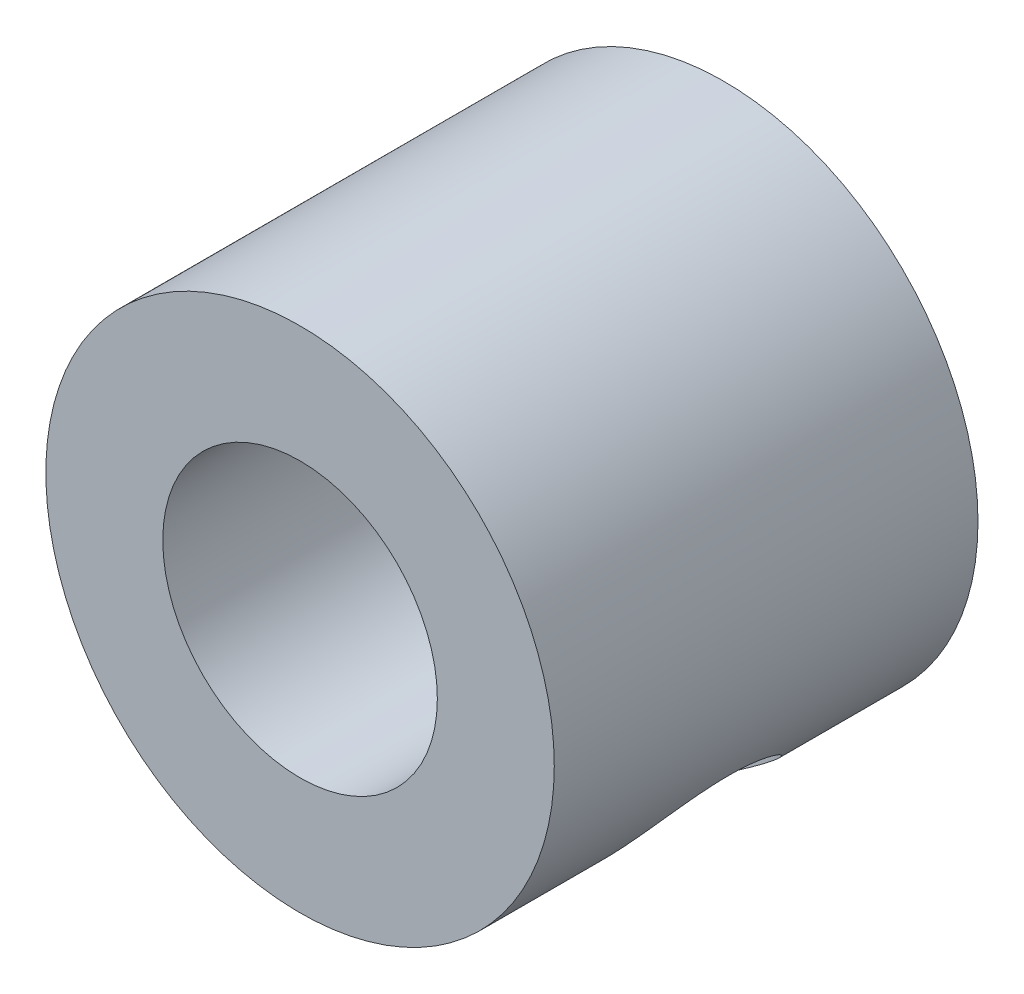
ISO-10303-21;
HEADER;
FILE_DESCRIPTION(('STEP AP214'),'2;1');
FILE_NAME('part.step','',(''),(''),'','','');
FILE_SCHEMA(('AUTOMOTIVE_DESIGN { 1 0 10303 214 1 1 1 1 }'));
ENDSEC;
DATA;
#1=APPLICATION_CONTEXT('core data for automotive mechanical design processes');
#2=APPLICATION_PROTOCOL_DEFINITION('international standard','automotive_design',2000,#1);
#3=PRODUCT_CONTEXT('',#1,'mechanical');
#4=PRODUCT('Part','Part','',(#3));
#5=PRODUCT_RELATED_PRODUCT_CATEGORY('part','',(#4));
#6=PRODUCT_DEFINITION_FORMATION('','',#4);
#7=PRODUCT_DEFINITION_CONTEXT('part definition',#1,'design');
#8=PRODUCT_DEFINITION('design','',#6,#7);
#9=PRODUCT_DEFINITION_SHAPE('','',#8);
#10=(LENGTH_UNIT() NAMED_UNIT(*) SI_UNIT(.MILLI.,.METRE.));
#11=(NAMED_UNIT(*) PLANE_ANGLE_UNIT() SI_UNIT($,.RADIAN.));
#12=(NAMED_UNIT(*) SI_UNIT($,.STERADIAN.) SOLID_ANGLE_UNIT());
#13=UNCERTAINTY_MEASURE_WITH_UNIT(LENGTH_MEASURE(1.E-05),#10,'distance_accuracy_value','');
#14=(GEOMETRIC_REPRESENTATION_CONTEXT(3) GLOBAL_UNCERTAINTY_ASSIGNED_CONTEXT((#13)) GLOBAL_UNIT_ASSIGNED_CONTEXT((#10,
#11,#12)) REPRESENTATION_CONTEXT('',''));
#15=CARTESIAN_POINT('',(0.,0.,0.));
#16=DIRECTION('',(0.,0.,1.));
#17=DIRECTION('',(1.,0.,0.));
#18=AXIS2_PLACEMENT_3D('',#15,#16,#17);
#19=CARTESIAN_POINT('',(0.,0.,5.));
#20=DIRECTION('',(0.,0.,1.));
#21=DIRECTION('',(1.,0.,0.));
#22=AXIS2_PLACEMENT_3D('',#19,#20,#21);
#23=PLANE('',#22);
#24=CARTESIAN_POINT('',(0.,0.,5.));
#25=DIRECTION('',(0.,0.,1.));
#26=DIRECTION('',(1.,0.,0.));
#27=AXIS2_PLACEMENT_3D('',#24,#25,#26);
#28=CIRCLE('',#27,3.);
#29=CARTESIAN_POINT('',(3.,0.,5.));
#30=VERTEX_POINT('',#29);
#31=EDGE_CURVE('E10',#30,#30,#28,.T.);
#32=ORIENTED_EDGE('',*,*,#31,.T.);
#33=EDGE_LOOP('',(#32));
#34=FACE_BOUND('',#33,.T.);
#35=CARTESIAN_POINT('',(0.,0.,5.));
#36=DIRECTION('',(0.,0.,1.));
#37=DIRECTION('',(1.,0.,0.));
#38=AXIS2_PLACEMENT_3D('',#35,#36,#37);
#39=CIRCLE('',#38,1.62);
#40=CARTESIAN_POINT('',(1.62,0.,5.));
#41=VERTEX_POINT('',#40);
#42=EDGE_CURVE('E48',#41,#41,#39,.T.);
#43=ORIENTED_EDGE('',*,*,#42,.F.);
#44=EDGE_LOOP('',(#43));
#45=FACE_BOUND('',#44,.T.);
#46=ADVANCED_FACE('F36',(#34,#45),#23,.T.);
#47=CARTESIAN_POINT('',(0.,0.,0.));
#48=DIRECTION('',(0.,0.,1.));
#49=DIRECTION('',(1.,0.,0.));
#50=AXIS2_PLACEMENT_3D('',#47,#48,#49);
#51=PLANE('',#50);
#52=CARTESIAN_POINT('',(0.,0.,0.));
#53=DIRECTION('',(0.,0.,1.));
#54=DIRECTION('',(1.,0.,0.));
#55=AXIS2_PLACEMENT_3D('',#52,#53,#54);
#56=CIRCLE('',#55,3.);
#57=CARTESIAN_POINT('',(3.,0.,0.));
#58=VERTEX_POINT('',#57);
#59=EDGE_CURVE('E41',#58,#58,#56,.T.);
#60=ORIENTED_EDGE('',*,*,#59,.F.);
#61=EDGE_LOOP('',(#60));
#62=FACE_BOUND('',#61,.T.);
#63=CARTESIAN_POINT('',(0.,0.,0.));
#64=DIRECTION('',(0.,0.,1.));
#65=DIRECTION('',(1.,0.,0.));
#66=AXIS2_PLACEMENT_3D('',#63,#64,#65);
#67=CIRCLE('',#66,1.62);
#68=CARTESIAN_POINT('',(1.62,0.,0.));
#69=VERTEX_POINT('',#68);
#70=EDGE_CURVE('E50',#69,#69,#67,.T.);
#71=ORIENTED_EDGE('',*,*,#70,.T.);
#72=EDGE_LOOP('',(#71));
#73=FACE_BOUND('',#72,.T.);
#74=ADVANCED_FACE('F79',(#62,#73),#51,.F.);
#75=CARTESIAN_POINT('',(0.,0.,5.));
#76=DIRECTION('',(0.,0.,-1.));
#77=DIRECTION('',(-1.,0.,0.));
#78=AXIS2_PLACEMENT_3D('',#75,#76,#77);
#79=CYLINDRICAL_SURFACE('',#78,3.);
#80=CARTESIAN_POINT('',(0.739618016125054,-2.90739835423755,2.5));
#81=CARTESIAN_POINT('',(0.739614752000209,-2.90739796712364,2.56101813663896));
#82=CARTESIAN_POINT('',(0.744813597752829,-2.9060911034385,2.62202056284591));
#83=CARTESIAN_POINT('',(0.76526503725104,-2.90077229528854,2.74218484382022));
#84=CARTESIAN_POINT('',(0.780517255640158,-2.89676045181772,2.80134676721893));
#85=CARTESIAN_POINT('',(0.820134425312808,-2.88579211793485,2.91606066757425));
#86=CARTESIAN_POINT('',(0.844477353800911,-2.87884273855745,2.97162099093799));
#87=CARTESIAN_POINT('',(0.901072264841386,-2.86163254910078,3.077995896953));
#88=CARTESIAN_POINT('',(0.933326646620744,-2.85137073419359,3.12880903350555));
#89=CARTESIAN_POINT('',(1.00603391773113,-2.8265587509176,3.22679720527209));
#90=CARTESIAN_POINT('',(1.04679376878659,-2.81183425795071,3.2737004036486));
#91=CARTESIAN_POINT('',(1.13393194453624,-2.77783794733051,3.36006599547149));
#92=CARTESIAN_POINT('',(1.18031147875629,-2.75856514989553,3.39952678239674));
#93=CARTESIAN_POINT('',(1.27873069768353,-2.71437871750808,3.47120041370083));
#94=CARTESIAN_POINT('',(1.33091019478213,-2.68929386729197,3.50311728538749));
#95=CARTESIAN_POINT('',(1.43760485141988,-2.63379963602439,3.55681558519246));
#96=CARTESIAN_POINT('',(1.49211918533939,-2.60339212556305,3.57860056424879));
#97=CARTESIAN_POINT('',(1.59906488803522,-2.53903811323399,3.61046181083468));
#98=CARTESIAN_POINT('',(1.6514837110736,-2.50530309604205,3.62100618459055));
#99=CARTESIAN_POINT('',(1.75478735428696,-2.43406097562897,3.63158729810365));
#100=CARTESIAN_POINT('',(1.805672672499,-2.39655511460608,3.63162748689658));
#101=CARTESIAN_POINT('',(1.90182338742011,-2.32091054159144,3.62147058362302));
#102=CARTESIAN_POINT('',(1.94724253121438,-2.28289694439422,3.61178457210585));
#103=CARTESIAN_POINT('',(2.0341504014462,-2.2058122594158,3.5833105992365));
#104=CARTESIAN_POINT('',(2.07563884901385,-2.16674109685627,3.56452199266254));
#105=CARTESIAN_POINT('',(2.15450923770586,-2.08835560004707,3.51814133714635));
#106=CARTESIAN_POINT('',(2.1918223934854,-2.0490460416503,3.49042478361183));
#107=CARTESIAN_POINT('',(2.26120944046165,-1.97221091217223,3.42708564664656));
#108=CARTESIAN_POINT('',(2.29328162710737,-1.93468592429934,3.39146049990748));
#109=CARTESIAN_POINT('',(2.35373048969377,-1.86074369979092,3.31085844315593));
#110=CARTESIAN_POINT('',(2.38177741335426,-1.82452249962875,3.26545373941419));
#111=CARTESIAN_POINT('',(2.43173192025713,-1.75739429138224,3.16782503055808));
#112=CARTESIAN_POINT('',(2.45363793183586,-1.7264886445055,3.11559928471646));
#113=CARTESIAN_POINT('',(2.49173867267264,-1.67104737272896,3.00429096561629));
#114=CARTESIAN_POINT('',(2.50779320407762,-1.64667141938392,2.9450801470621));
#115=CARTESIAN_POINT('',(2.53346804066745,-1.6068935592993,2.82240630334902));
#116=CARTESIAN_POINT('',(2.54309196715564,-1.59148660242805,2.75894569359098));
#117=CARTESIAN_POINT('',(2.55553564947608,-1.57142293838382,2.63334876547248));
#118=CARTESIAN_POINT('',(2.55870395375538,-1.56621616535229,2.57133498368438));
#119=CARTESIAN_POINT('',(2.55927681088035,-1.56528074382059,2.44721760437008));
#120=CARTESIAN_POINT('',(2.55668282373574,-1.56954969442664,2.38511403357844));
#121=CARTESIAN_POINT('',(2.54601068058257,-1.58679625688727,2.26571111370284));
#122=CARTESIAN_POINT('',(2.53820230030048,-1.59934512814585,2.20832436208521));
#123=CARTESIAN_POINT('',(2.51739757812413,-1.63189455227808,2.09669661413096));
#124=CARTESIAN_POINT('',(2.50440016722658,-1.65189664054825,2.04245626863086));
#125=CARTESIAN_POINT('',(2.47263536489686,-1.69909100064847,1.93638563609826));
#126=CARTESIAN_POINT('',(2.45366885649637,-1.72652598692998,1.88472338339198));
#127=CARTESIAN_POINT('',(2.41014616603731,-1.7867777894499,1.78721061199356));
#128=CARTESIAN_POINT('',(2.3855879209934,-1.81959659071189,1.74136224799039));
#129=CARTESIAN_POINT('',(2.32913562302335,-1.89138568549983,1.65372970517089));
#130=CARTESIAN_POINT('',(2.29687224969338,-1.93061544359174,1.61239442350959));
#131=CARTESIAN_POINT('',(2.22617301710366,-2.01172669205411,1.53852022619436));
#132=CARTESIAN_POINT('',(2.18773712377136,-2.05360819706153,1.50598135909962));
#133=CARTESIAN_POINT('',(2.1052527026915,-2.13807862505327,1.4508321746073));
#134=CARTESIAN_POINT('',(2.06122293593891,-2.18066478750009,1.42818974427247));
#135=CARTESIAN_POINT('',(1.96832006220759,-2.26487041478652,1.39356794559513));
#136=CARTESIAN_POINT('',(1.91944926781643,-2.30649032959083,1.38158351290485));
#137=CARTESIAN_POINT('',(1.82119250488052,-2.3847369270471,1.36916783652974));
#138=CARTESIAN_POINT('',(1.77200560418259,-2.42151331032074,1.36809901225347));
#139=CARTESIAN_POINT('',(1.67199773656454,-2.49161613936039,1.37590184797056));
#140=CARTESIAN_POINT('',(1.62117697062316,-2.52494300733297,1.38477228986298));
#141=CARTESIAN_POINT('',(1.52080704439269,-2.58660650307536,1.41175350768873));
#142=CARTESIAN_POINT('',(1.47125761958077,-2.61504643014469,1.42962955539162));
#143=CARTESIAN_POINT('',(1.37368715073943,-2.66759393764062,1.47387995094849));
#144=CARTESIAN_POINT('',(1.32566639801285,-2.69170069635999,1.50025590801409));
#145=CARTESIAN_POINT('',(1.23064805152727,-2.73649065046568,1.5620233184274));
#146=CARTESIAN_POINT('',(1.18377922703172,-2.75698636090658,1.59774835422172));
#147=CARTESIAN_POINT('',(1.09482759745554,-2.79350469326137,1.67667557545808));
#148=CARTESIAN_POINT('',(1.05274651611616,-2.8095257071421,1.71988043985014));
#149=CARTESIAN_POINT('',(0.972780612058389,-2.8382388920146,1.81528319548287));
#150=CARTESIAN_POINT('',(0.935239850380158,-2.85070762713379,1.86783810508343));
#151=CARTESIAN_POINT('',(0.868824280584228,-2.87164788558065,1.97890925074341));
#152=CARTESIAN_POINT('',(0.839950530293186,-2.88011892105295,2.03742621331721));
#153=CARTESIAN_POINT('',(0.791313671493419,-2.89387269626417,2.16181258603167));
#154=CARTESIAN_POINT('',(0.772053214087564,-2.89898327955144,2.22789991696844));
#155=CARTESIAN_POINT('',(0.746211518334039,-2.90574515433204,2.36266598741546));
#156=CARTESIAN_POINT('',(0.739621688889111,-2.90739878981467,2.43134293884242));
#157=CARTESIAN_POINT('',(0.739618016125054,-2.90739835423755,2.5));
#158=B_SPLINE_CURVE_WITH_KNOTS('',3,(#80,#81,#82,#83,#84,#85,#86,#87,#88,#89,#90,#91,#92,#93,
#94,#95,#96,#97,#98,#99,#100,#101,#102,#103,#104,#105,#106,#107,#108,#109,#110,#111,#112,#113,
#114,#115,#116,#117,#118,#119,#120,#121,#122,#123,#124,#125,#126,#127,#128,#129,#130,#131,#132,
#133,#134,#135,#136,#137,#138,#139,#140,#141,#142,#143,#144,#145,#146,#147,#148,#149,#150,#151,
#152,#153,#154,#155,#156,#157),.UNSPECIFIED.,.T.,.F.,(4,2,2,2,2,2,2,2,2,2,2,2,2,2,2,2,2,2,2,2,2,
2,2,2,2,2,2,2,2,2,2,2,2,2,2,2,2,2,4),(0.,0.182798687678897,0.365590550704326,0.547942432096648,
0.730349682032612,0.921080888922843,1.11185322010347,1.30918710749725,1.5064517828052,
1.69513544671701,1.88375715651128,2.06296037041627,2.24217628869147,2.4240083102534,
2.60589935290765,2.79852376321542,2.99119742760116,3.18822362371484,3.38513877362039,
3.57110586771534,3.75702584812362,3.93400354020582,4.11101771066984,4.29470759898304,
4.47846536698335,4.67400202026015,4.86953975294349,5.06443818763901,5.25924396312408,
5.44260114028839,5.62593584867891,5.80472173005681,5.98354147926692,6.16991005225352,
6.35634551298868,6.5527362862576,6.74915101968909,6.95497407078195,7.16065751788153),.UNSPECIFIED.);
#159=CARTESIAN_POINT('',(0.739618016125054,-2.90739835423755,2.5));
#160=VERTEX_POINT('',#159);
#161=EDGE_CURVE('E62',#160,#160,#158,.T.);
#162=ORIENTED_EDGE('',*,*,#161,.T.);
#163=EDGE_LOOP('',(#162));
#164=FACE_BOUND('',#163,.T.);
#165=ORIENTED_EDGE('',*,*,#31,.F.);
#166=EDGE_LOOP('',(#165));
#167=FACE_BOUND('',#166,.T.);
#168=ORIENTED_EDGE('',*,*,#59,.T.);
#169=EDGE_LOOP('',(#168));
#170=FACE_BOUND('',#169,.T.);
#171=ADVANCED_FACE('F38',(#164,#167,#170),#79,.T.);
#172=CARTESIAN_POINT('',(0.,0.,5.));
#173=DIRECTION('',(0.,0.,-1.));
#174=DIRECTION('',(-1.,0.,0.));
#175=AXIS2_PLACEMENT_3D('',#172,#173,#174);
#176=CYLINDRICAL_SURFACE('',#175,1.62);
#177=CARTESIAN_POINT('',(0.961483510154803,-1.30382109957632,1.3697));
#178=CARTESIAN_POINT('',(0.916214891446408,-1.33720642885847,1.36969767579119));
#179=CARTESIAN_POINT('',(0.869200596062368,-1.36820439966834,1.37392081596528));
#180=CARTESIAN_POINT('',(0.773298502505767,-1.42460721454204,1.39053311704845));
#181=CARTESIAN_POINT('',(0.72441008526245,-1.45001019141492,1.40292499858075));
#182=CARTESIAN_POINT('',(0.626679722125398,-1.49484232684783,1.43508877459202));
#183=CARTESIAN_POINT('',(0.577838680154775,-1.51429958253214,1.45482494892398));
#184=CARTESIAN_POINT('',(0.481380944058133,-1.54766935734356,1.50080594719309));
#185=CARTESIAN_POINT('',(0.433764428273312,-1.56158107304333,1.52705171333471));
#186=CARTESIAN_POINT('',(0.336807757332645,-1.58545502545243,1.5877975882735));
#187=CARTESIAN_POINT('',(0.287685366384149,-1.59496130117617,1.62282121486402));
#188=CARTESIAN_POINT('',(0.193447026961361,-1.60911604415115,1.69883112871715));
#189=CARTESIAN_POINT('',(0.148337224270734,-1.61375717319425,1.73982631725644));
#190=CARTESIAN_POINT('',(0.0559950013026046,-1.61980150411806,1.83487768344551));
#191=CARTESIAN_POINT('',(0.00976989853048561,-1.62049689959732,1.88996431057498));
#192=CARTESIAN_POINT('',(-0.0727450911453279,-1.61889102558277,2.00710907091963));
#193=CARTESIAN_POINT('',(-0.109051641889199,-1.61659482010446,2.06915526104149));
#194=CARTESIAN_POINT('',(-0.158964158469272,-1.61231323922361,2.17920622685966));
#195=CARTESIAN_POINT('',(-0.176118260755016,-1.61045225874634,2.22559929451177));
#196=CARTESIAN_POINT('',(-0.202581979388926,-1.60733985919007,2.32056134121796));
#197=CARTESIAN_POINT('',(-0.211906813184806,-1.60608725963243,2.36912590509906));
#198=CARTESIAN_POINT('',(-0.221752450278551,-1.60475993166395,2.46745715188639));
#199=CARTESIAN_POINT('',(-0.222223860856442,-1.60469181154952,2.5172290287039));
#200=CARTESIAN_POINT('',(-0.214172527369595,-1.60578450646299,2.61603745990592));
#201=CARTESIAN_POINT('',(-0.205643542226735,-1.60694617425545,2.66507348010241));
#202=CARTESIAN_POINT('',(-0.181376968365726,-1.60985604803902,2.75787430889892));
#203=CARTESIAN_POINT('',(-0.166138888354867,-1.61156167181204,2.80177522583084));
#204=CARTESIAN_POINT('',(-0.129780868515034,-1.61489637150721,2.88706268527481));
#205=CARTESIAN_POINT('',(-0.108656235882301,-1.61652538513916,2.92844718948435));
#206=CARTESIAN_POINT('',(-0.0492261982249113,-1.61964843587416,3.02941976939676));
#207=CARTESIAN_POINT('',(-0.0077250297824964,-1.62062199949823,3.0871497141305));
#208=CARTESIAN_POINT('',(0.0835735704279949,-1.61849007474025,3.19562891148045));
#209=CARTESIAN_POINT('',(0.133387661763141,-1.61537630730877,3.24636376500187));
#210=CARTESIAN_POINT('',(0.239781656646143,-1.60306199199592,3.34069352290339));
#211=CARTESIAN_POINT('',(0.296432677590631,-1.59379196658626,3.38419975821162));
#212=CARTESIAN_POINT('',(0.413954447455322,-1.56737082447727,3.46208195534699));
#213=CARTESIAN_POINT('',(0.474816108475231,-1.5502362574447,3.49647685199386));
#214=CARTESIAN_POINT('',(0.584720838478121,-1.51165678563217,3.54809089476353));
#215=CARTESIAN_POINT('',(0.633399314416858,-1.49200445101012,3.56742651545276));
#216=CARTESIAN_POINT('',(0.730476153243901,-1.44694837599678,3.59872453570209));
#217=CARTESIAN_POINT('',(0.778874684554569,-1.42154856792929,3.61069195572648));
#218=CARTESIAN_POINT('',(0.873976625152624,-1.36514886472255,3.62661709731383));
#219=CARTESIAN_POINT('',(0.920672580215273,-1.33412723682137,3.63054298076009));
#220=CARTESIAN_POINT('',(1.01054762519373,-1.26740856310546,3.63003370609553));
#221=CARTESIAN_POINT('',(1.05372683137532,-1.23171167195952,3.62559882451364));
#222=CARTESIAN_POINT('',(1.13268693511286,-1.15935640890654,3.60920272444577));
#223=CARTESIAN_POINT('',(1.16876412033327,-1.12290478071722,3.59773988366612));
#224=CARTESIAN_POINT('',(1.23614160816024,-1.04827656546145,3.56831777501531));
#225=CARTESIAN_POINT('',(1.26744101954711,-1.01009965828807,3.55035729721115));
#226=CARTESIAN_POINT('',(1.32715762681862,-0.930433763628971,3.50714760347533));
#227=CARTESIAN_POINT('',(1.3552055056219,-0.88890407993297,3.48146699749516));
#228=CARTESIAN_POINT('',(1.40580312217048,-0.80651072550732,3.42429129675422));
#229=CARTESIAN_POINT('',(1.42834929721519,-0.76564750224858,3.39279245738986));
#230=CARTESIAN_POINT('',(1.4717868528625,-0.678951988222172,3.3188342739061));
#231=CARTESIAN_POINT('',(1.49173889960631,-0.63346207320909,3.27542180247906));
#232=CARTESIAN_POINT('',(1.52560016597773,-0.546904379605222,3.1822266829546));
#233=CARTESIAN_POINT('',(1.53950484283,-0.505839942784822,3.13243928223394));
#234=CARTESIAN_POINT('',(1.56110114711493,-0.434297497753118,3.03226811878382));
#235=CARTESIAN_POINT('',(1.56927986437226,-0.403168212679154,2.98245690924942));
#236=CARTESIAN_POINT('',(1.58229257797051,-0.348623732544646,2.87838477754253));
#237=CARTESIAN_POINT('',(1.58713313678669,-0.325193449812219,2.82413282179164));
#238=CARTESIAN_POINT('',(1.59348838930016,-0.292268075433002,2.72314134706576));
#239=CARTESIAN_POINT('',(1.59547151653657,-0.280933429742178,2.67703810646333));
#240=CARTESIAN_POINT('',(1.59801257695046,-0.266112578934627,2.58356499486414));
#241=CARTESIAN_POINT('',(1.59857228971159,-0.262616574426782,2.5361967803493));
#242=CARTESIAN_POINT('',(1.59836103156764,-0.263897754429096,2.44153211160772));
#243=CARTESIAN_POINT('',(1.59758875319659,-0.268683067793743,2.394235773552));
#244=CARTESIAN_POINT('',(1.59458710801707,-0.285945871442388,2.30109402748248));
#245=CARTESIAN_POINT('',(1.59235561724224,-0.298434572939199,2.25525083674672));
#246=CARTESIAN_POINT('',(1.585251292545,-0.334363690178502,2.15314455168587));
#247=CARTESIAN_POINT('',(1.57980364095712,-0.359920116260305,2.09767353212361));
#248=CARTESIAN_POINT('',(1.56522067134592,-0.418810945849665,1.99157419338259));
#249=CARTESIAN_POINT('',(1.55607963498968,-0.452157376410459,1.94095353488607));
#250=CARTESIAN_POINT('',(1.53301272959984,-0.525139500049865,1.8437719492399));
#251=CARTESIAN_POINT('',(1.51897977317705,-0.564904241130862,1.79733392593596));
#252=CARTESIAN_POINT('',(1.48532895177894,-0.648244178069395,1.71024512737674));
#253=CARTESIAN_POINT('',(1.465709233536,-0.6918206350389,1.66959627925833));
#254=CARTESIAN_POINT('',(1.41605205840991,-0.789101347618993,1.5880725304156));
#255=CARTESIAN_POINT('',(1.38478502441674,-0.843232553077702,1.54843234512863));
#256=CARTESIAN_POINT('',(1.31254011055501,-0.951770835157976,1.47973869061142));
#257=CARTESIAN_POINT('',(1.27157489629019,-1.00617746214757,1.45067153778009));
#258=CARTESIAN_POINT('',(1.18774963846785,-1.10319691694239,1.40892061839318));
#259=CARTESIAN_POINT('',(1.14637151307393,-1.14625246296688,1.39430172415098));
#260=CARTESIAN_POINT('',(1.05783987224255,-1.22841639833776,1.37469826272749));
#261=CARTESIAN_POINT('',(1.01069311979386,-1.26752931359917,1.36970252654955));
#262=CARTESIAN_POINT('',(0.961483510154803,-1.30382109957632,1.3697));
#263=B_SPLINE_CURVE_WITH_KNOTS('',3,(#177,#178,#179,#180,#181,#182,#183,#184,#185,#186,#187,
#188,#189,#190,#191,#192,#193,#194,#195,#196,#197,#198,#199,#200,#201,#202,#203,#204,#205,#206,
#207,#208,#209,#210,#211,#212,#213,#214,#215,#216,#217,#218,#219,#220,#221,#222,#223,#224,#225,
#226,#227,#228,#229,#230,#231,#232,#233,#234,#235,#236,#237,#238,#239,#240,#241,#242,#243,#244,
#245,#246,#247,#248,#249,#250,#251,#252,#253,#254,#255,#256,#257,#258,#259,#260,#261,#262),
.UNSPECIFIED.,.T.,.F.,(4,2,2,2,2,2,2,2,2,2,2,2,2,2,2,2,2,2,2,2,2,2,2,2,2,2,2,2,2,2,2,2,2,2,2,2,
2,2,2,2,2,2,4),(0.,0.16849709769124,0.337050342206331,0.50479429343489,0.672562538264843,
0.855112071688617,1.03793655414803,1.25271901379687,1.46713837360754,1.61507099010498,
1.76271540564238,1.91118327738128,2.05975416779456,2.19875884800045,2.33787466237741,
2.55007254509324,2.76270090688809,2.97777065420063,3.19238988214741,3.35952200537391,
3.52654012354236,3.6942182329652,3.86189079659955,4.01886283607094,4.17586412055708,
4.34415975143046,4.51256407685129,4.70971320097302,4.90701016849736,5.08429808668764,
5.26123647387439,5.40318102395957,5.54494802445214,5.68685426088345,5.82896751103317,
6.01192557530331,6.19516799901503,6.38270366096257,6.57030160576364,6.79112079309193,
7.01165317113839,7.19503223763476,7.37819833899323),.UNSPECIFIED.);
#264=CARTESIAN_POINT('',(0.961483510154803,-1.30382109957632,1.3697));
#265=VERTEX_POINT('',#264);
#266=EDGE_CURVE('E53',#265,#265,#263,.T.);
#267=ORIENTED_EDGE('',*,*,#266,.F.);
#268=EDGE_LOOP('',(#267));
#269=FACE_BOUND('',#268,.T.);
#270=ORIENTED_EDGE('',*,*,#42,.T.);
#271=EDGE_LOOP('',(#270));
#272=FACE_BOUND('',#271,.T.);
#273=ORIENTED_EDGE('',*,*,#70,.F.);
#274=EDGE_LOOP('',(#273));
#275=FACE_BOUND('',#274,.T.);
#276=ADVANCED_FACE('F70',(#269,#272,#275),#176,.F.);
#277=CARTESIAN_POINT('',(0.961483510154803,-1.30382109957632,2.5));
#278=DIRECTION('',(-0.59350833960173,0.804827839244641,0.));
#279=DIRECTION('',(-0.804827839244641,-0.59350833960173,0.));
#280=AXIS2_PLACEMENT_3D('',#277,#278,#279);
#281=CYLINDRICAL_SURFACE('',#280,1.1303);
#282=ORIENTED_EDGE('',*,*,#266,.T.);
#283=EDGE_LOOP('',(#282));
#284=FACE_BOUND('',#283,.T.);
#285=ORIENTED_EDGE('',*,*,#161,.F.);
#286=EDGE_LOOP('',(#285));
#287=FACE_BOUND('',#286,.T.);
#288=ADVANCED_FACE('F67',(#284,#287),#281,.F.);
#289=CLOSED_SHELL('',(#46,#74,#171,#276,#288));
#290=MANIFOLD_SOLID_BREP('B2',#289);
#291=ADVANCED_BREP_SHAPE_REPRESENTATION('',(#18,#290),#14);
#292=SHAPE_DEFINITION_REPRESENTATION(#9,#291);
ENDSEC;
END-ISO-10303-21;
